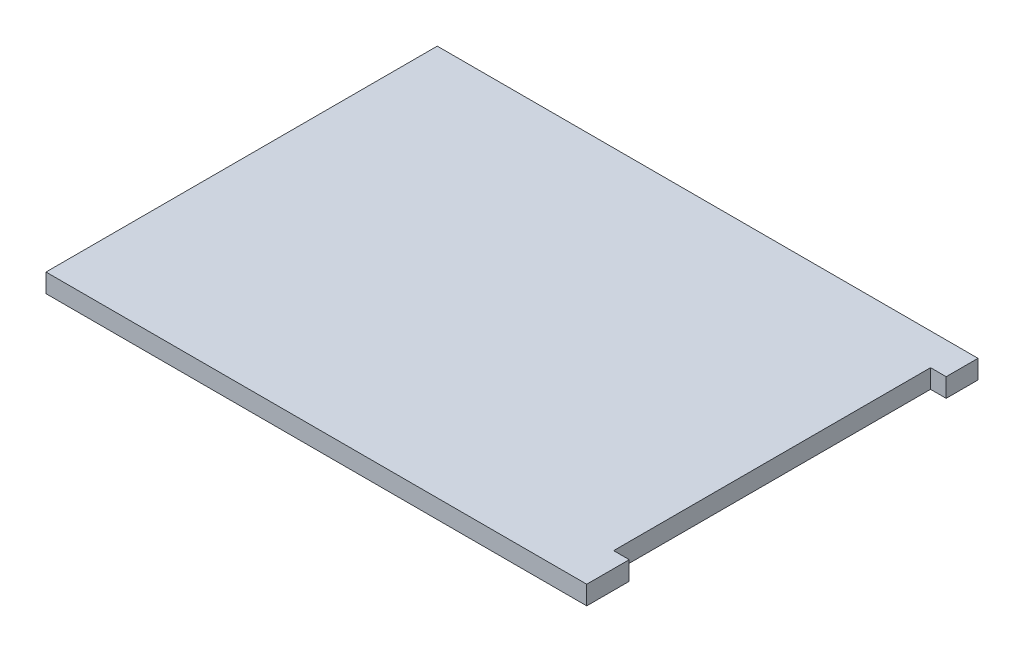
ISO-10303-21;
HEADER;
FILE_DESCRIPTION(('STEP AP214'),'2;1');
FILE_NAME('part.step','',(''),(''),'','','');
FILE_SCHEMA(('AUTOMOTIVE_DESIGN { 1 0 10303 214 1 1 1 1 }'));
ENDSEC;
DATA;
#1=APPLICATION_CONTEXT('core data for automotive mechanical design processes');
#2=APPLICATION_PROTOCOL_DEFINITION('international standard','automotive_design',2000,#1);
#3=PRODUCT_CONTEXT('',#1,'mechanical');
#4=PRODUCT('Part','Part','',(#3));
#5=PRODUCT_RELATED_PRODUCT_CATEGORY('part','',(#4));
#6=PRODUCT_DEFINITION_FORMATION('','',#4);
#7=PRODUCT_DEFINITION_CONTEXT('part definition',#1,'design');
#8=PRODUCT_DEFINITION('design','',#6,#7);
#9=PRODUCT_DEFINITION_SHAPE('','',#8);
#10=(LENGTH_UNIT() NAMED_UNIT(*) SI_UNIT(.MILLI.,.METRE.));
#11=(NAMED_UNIT(*) PLANE_ANGLE_UNIT() SI_UNIT($,.RADIAN.));
#12=(NAMED_UNIT(*) SI_UNIT($,.STERADIAN.) SOLID_ANGLE_UNIT());
#13=UNCERTAINTY_MEASURE_WITH_UNIT(LENGTH_MEASURE(1.E-05),#10,'distance_accuracy_value','');
#14=(GEOMETRIC_REPRESENTATION_CONTEXT(3) GLOBAL_UNCERTAINTY_ASSIGNED_CONTEXT((#13)) GLOBAL_UNIT_ASSIGNED_CONTEXT((#10,
#11,#12)) REPRESENTATION_CONTEXT('',''));
#15=CARTESIAN_POINT('',(0.,0.,0.));
#16=DIRECTION('',(0.,0.,1.));
#17=DIRECTION('',(1.,0.,0.));
#18=AXIS2_PLACEMENT_3D('',#15,#16,#17);
#19=CARTESIAN_POINT('',(37.7,2.4,25.));
#20=DIRECTION('',(-1.,0.,0.));
#21=DIRECTION('',(0.,0.,1.));
#22=AXIS2_PLACEMENT_3D('',#19,#20,#21);
#23=PLANE('',#22);
#24=DIRECTION('',(0.,0.,-1.));
#25=VECTOR('',#24,1.);
#26=CARTESIAN_POINT('',(37.7,2.4,25.));
#27=LINE('',#26,#25);
#28=CARTESIAN_POINT('',(37.7,2.4,-20.932318686014));
#29=VERTEX_POINT('',#28);
#30=CARTESIAN_POINT('',(37.7,2.4,-25.));
#31=VERTEX_POINT('',#30);
#32=EDGE_CURVE('E90',#29,#31,#27,.T.);
#33=ORIENTED_EDGE('',*,*,#32,.F.);
#34=DIRECTION('',(0.,-1.,0.));
#35=VECTOR('',#34,1.);
#36=CARTESIAN_POINT('',(37.7,2.4,-20.932318686014));
#37=LINE('',#36,#35);
#38=CARTESIAN_POINT('',(37.7,0.,-20.932318686014));
#39=VERTEX_POINT('',#38);
#40=EDGE_CURVE('E139',#29,#39,#37,.T.);
#41=ORIENTED_EDGE('',*,*,#40,.T.);
#42=DIRECTION('',(0.,0.,-1.));
#43=VECTOR('',#42,1.);
#44=CARTESIAN_POINT('',(37.7,0.,25.));
#45=LINE('',#44,#43);
#46=CARTESIAN_POINT('',(37.7,0.,-25.));
#47=VERTEX_POINT('',#46);
#48=EDGE_CURVE('E142',#39,#47,#45,.T.);
#49=ORIENTED_EDGE('',*,*,#48,.T.);
#50=DIRECTION('',(0.,-1.,0.));
#51=VECTOR('',#50,1.);
#52=CARTESIAN_POINT('',(37.7,2.4,-25.));
#53=LINE('',#52,#51);
#54=EDGE_CURVE('E47',#31,#47,#53,.T.);
#55=ORIENTED_EDGE('',*,*,#54,.F.);
#56=EDGE_LOOP('',(#33,#41,#49,#55));
#57=FACE_BOUND('',#56,.T.);
#58=ADVANCED_FACE('F39',(#57),#23,.F.);
#59=CARTESIAN_POINT('',(37.7,0.,25.));
#60=VERTEX_POINT('',#59);
#61=CARTESIAN_POINT('',(37.7,0.,19.567681313986));
#62=VERTEX_POINT('',#61);
#63=EDGE_CURVE('E150',#60,#62,#45,.T.);
#64=ORIENTED_EDGE('',*,*,#63,.T.);
#65=DIRECTION('',(0.,1.,0.));
#66=VECTOR('',#65,1.);
#67=CARTESIAN_POINT('',(37.7,2.4,19.567681313986));
#68=LINE('',#67,#66);
#69=CARTESIAN_POINT('',(37.7,2.4,19.567681313986));
#70=VERTEX_POINT('',#69);
#71=EDGE_CURVE('E53',#62,#70,#68,.T.);
#72=ORIENTED_EDGE('',*,*,#71,.T.);
#73=CARTESIAN_POINT('',(37.7,2.4,25.));
#74=VERTEX_POINT('',#73);
#75=EDGE_CURVE('E129',#74,#70,#27,.T.);
#76=ORIENTED_EDGE('',*,*,#75,.F.);
#77=DIRECTION('',(0.,-1.,0.));
#78=VECTOR('',#77,1.);
#79=CARTESIAN_POINT('',(37.7,2.4,25.));
#80=LINE('',#79,#78);
#81=EDGE_CURVE('E149',#74,#60,#80,.T.);
#82=ORIENTED_EDGE('',*,*,#81,.T.);
#83=EDGE_LOOP('',(#64,#72,#76,#82));
#84=FACE_BOUND('',#83,.T.);
#85=ADVANCED_FACE('F41',(#84),#23,.F.);
#86=CARTESIAN_POINT('',(-31.4,2.4,-25.));
#87=DIRECTION('',(0.,0.,1.));
#88=DIRECTION('',(1.,0.,0.));
#89=AXIS2_PLACEMENT_3D('',#86,#87,#88);
#90=PLANE('',#89);
#91=DIRECTION('',(-1.,0.,0.));
#92=VECTOR('',#91,1.);
#93=CARTESIAN_POINT('',(-31.4,0.,-25.));
#94=LINE('',#93,#92);
#95=CARTESIAN_POINT('',(-31.4,0.,-25.));
#96=VERTEX_POINT('',#95);
#97=EDGE_CURVE('E153',#47,#96,#94,.T.);
#98=ORIENTED_EDGE('',*,*,#97,.T.);
#99=DIRECTION('',(0.,-1.,0.));
#100=VECTOR('',#99,1.);
#101=CARTESIAN_POINT('',(-31.4,2.4,-25.));
#102=LINE('',#101,#100);
#103=CARTESIAN_POINT('',(-31.4,2.4,-25.));
#104=VERTEX_POINT('',#103);
#105=EDGE_CURVE('E161',#104,#96,#102,.T.);
#106=ORIENTED_EDGE('',*,*,#105,.F.);
#107=DIRECTION('',(-1.,0.,0.));
#108=VECTOR('',#107,1.);
#109=CARTESIAN_POINT('',(-31.4,2.4,-25.));
#110=LINE('',#109,#108);
#111=EDGE_CURVE('E144',#31,#104,#110,.T.);
#112=ORIENTED_EDGE('',*,*,#111,.F.);
#113=ORIENTED_EDGE('',*,*,#54,.T.);
#114=EDGE_LOOP('',(#98,#106,#112,#113));
#115=FACE_BOUND('',#114,.T.);
#116=ADVANCED_FACE('F166',(#115),#90,.F.);
#117=CARTESIAN_POINT('',(-31.4,2.4,25.));
#118=DIRECTION('',(1.,0.,0.));
#119=DIRECTION('',(0.,0.,-1.));
#120=AXIS2_PLACEMENT_3D('',#117,#118,#119);
#121=PLANE('',#120);
#122=DIRECTION('',(0.,0.,1.));
#123=VECTOR('',#122,1.);
#124=CARTESIAN_POINT('',(-31.4,0.,25.));
#125=LINE('',#124,#123);
#126=CARTESIAN_POINT('',(-31.4,0.,25.));
#127=VERTEX_POINT('',#126);
#128=EDGE_CURVE('E155',#96,#127,#125,.T.);
#129=ORIENTED_EDGE('',*,*,#128,.T.);
#130=DIRECTION('',(0.,-1.,0.));
#131=VECTOR('',#130,1.);
#132=CARTESIAN_POINT('',(-31.4,2.4,25.));
#133=LINE('',#132,#131);
#134=CARTESIAN_POINT('',(-31.4,2.4,25.));
#135=VERTEX_POINT('',#134);
#136=EDGE_CURVE('E159',#135,#127,#133,.T.);
#137=ORIENTED_EDGE('',*,*,#136,.F.);
#138=DIRECTION('',(0.,0.,1.));
#139=VECTOR('',#138,1.);
#140=CARTESIAN_POINT('',(-31.4,2.4,25.));
#141=LINE('',#140,#139);
#142=EDGE_CURVE('E146',#104,#135,#141,.T.);
#143=ORIENTED_EDGE('',*,*,#142,.F.);
#144=ORIENTED_EDGE('',*,*,#105,.T.);
#145=EDGE_LOOP('',(#129,#137,#143,#144));
#146=FACE_BOUND('',#145,.T.);
#147=ADVANCED_FACE('F178',(#146),#121,.F.);
#148=CARTESIAN_POINT('',(-31.4,2.4,25.));
#149=DIRECTION('',(0.,0.,-1.));
#150=DIRECTION('',(-1.,0.,0.));
#151=AXIS2_PLACEMENT_3D('',#148,#149,#150);
#152=PLANE('',#151);
#153=DIRECTION('',(1.,0.,0.));
#154=VECTOR('',#153,1.);
#155=CARTESIAN_POINT('',(-31.4,0.,25.));
#156=LINE('',#155,#154);
#157=EDGE_CURVE('E83',#127,#60,#156,.T.);
#158=ORIENTED_EDGE('',*,*,#157,.T.);
#159=ORIENTED_EDGE('',*,*,#81,.F.);
#160=DIRECTION('',(1.,0.,0.));
#161=VECTOR('',#160,1.);
#162=CARTESIAN_POINT('',(-31.4,2.4,25.));
#163=LINE('',#162,#161);
#164=EDGE_CURVE('E62',#135,#74,#163,.T.);
#165=ORIENTED_EDGE('',*,*,#164,.F.);
#166=ORIENTED_EDGE('',*,*,#136,.T.);
#167=EDGE_LOOP('',(#158,#159,#165,#166));
#168=FACE_BOUND('',#167,.T.);
#169=ADVANCED_FACE('F180',(#168),#152,.F.);
#170=CARTESIAN_POINT('',(0.,2.4,0.));
#171=DIRECTION('',(0.,-1.,0.));
#172=DIRECTION('',(0.,0.,-1.));
#173=AXIS2_PLACEMENT_3D('',#170,#171,#172);
#174=PLANE('',#173);
#175=DIRECTION('',(0.,0.,-1.));
#176=VECTOR('',#175,1.);
#177=CARTESIAN_POINT('',(35.7033053803765,2.4,-20.932318686014));
#178=LINE('',#177,#176);
#179=CARTESIAN_POINT('',(35.7033053803765,2.4,19.567681313986));
#180=VERTEX_POINT('',#179);
#181=CARTESIAN_POINT('',(35.7033053803765,2.4,-20.932318686014));
#182=VERTEX_POINT('',#181);
#183=EDGE_CURVE('E123',#180,#182,#178,.T.);
#184=ORIENTED_EDGE('',*,*,#183,.T.);
#185=DIRECTION('',(1.,0.,0.));
#186=VECTOR('',#185,1.);
#187=CARTESIAN_POINT('',(35.7033053803765,2.4,-20.932318686014));
#188=LINE('',#187,#186);
#189=EDGE_CURVE('E120',#182,#29,#188,.T.);
#190=ORIENTED_EDGE('',*,*,#189,.T.);
#191=ORIENTED_EDGE('',*,*,#32,.T.);
#192=ORIENTED_EDGE('',*,*,#111,.T.);
#193=ORIENTED_EDGE('',*,*,#142,.T.);
#194=ORIENTED_EDGE('',*,*,#164,.T.);
#195=ORIENTED_EDGE('',*,*,#75,.T.);
#196=DIRECTION('',(-1.,0.,0.));
#197=VECTOR('',#196,1.);
#198=CARTESIAN_POINT('',(35.7033053803765,2.4,19.567681313986));
#199=LINE('',#198,#197);
#200=EDGE_CURVE('E115',#70,#180,#199,.T.);
#201=ORIENTED_EDGE('',*,*,#200,.T.);
#202=EDGE_LOOP('',(#184,#190,#191,#192,#193,#194,#195,#201));
#203=FACE_BOUND('',#202,.T.);
#204=ADVANCED_FACE('F127',(#203),#174,.F.);
#205=CARTESIAN_POINT('',(0.,0.,0.));
#206=DIRECTION('',(0.,-1.,0.));
#207=DIRECTION('',(0.,0.,-1.));
#208=AXIS2_PLACEMENT_3D('',#205,#206,#207);
#209=PLANE('',#208);
#210=DIRECTION('',(1.,0.,0.));
#211=VECTOR('',#210,1.);
#212=CARTESIAN_POINT('',(35.7033053803765,0.,-20.932318686014));
#213=LINE('',#212,#211);
#214=CARTESIAN_POINT('',(35.7033053803765,0.,-20.932318686014));
#215=VERTEX_POINT('',#214);
#216=EDGE_CURVE('E130',#215,#39,#213,.T.);
#217=ORIENTED_EDGE('',*,*,#216,.F.);
#218=DIRECTION('',(0.,0.,-1.));
#219=VECTOR('',#218,1.);
#220=CARTESIAN_POINT('',(35.7033053803765,0.,-20.932318686014));
#221=LINE('',#220,#219);
#222=CARTESIAN_POINT('',(35.7033053803765,0.,19.567681313986));
#223=VERTEX_POINT('',#222);
#224=EDGE_CURVE('E132',#223,#215,#221,.T.);
#225=ORIENTED_EDGE('',*,*,#224,.F.);
#226=DIRECTION('',(-1.,0.,0.));
#227=VECTOR('',#226,1.);
#228=CARTESIAN_POINT('',(0.,0.,19.5676813139861));
#229=LINE('',#228,#227);
#230=EDGE_CURVE('E11',#62,#223,#229,.T.);
#231=ORIENTED_EDGE('',*,*,#230,.F.);
#232=ORIENTED_EDGE('',*,*,#63,.F.);
#233=ORIENTED_EDGE('',*,*,#157,.F.);
#234=ORIENTED_EDGE('',*,*,#128,.F.);
#235=ORIENTED_EDGE('',*,*,#97,.F.);
#236=ORIENTED_EDGE('',*,*,#48,.F.);
#237=EDGE_LOOP('',(#217,#225,#231,#232,#233,#234,#235,#236));
#238=FACE_BOUND('',#237,.T.);
#239=ADVANCED_FACE('F174',(#238),#209,.T.);
#240=CARTESIAN_POINT('',(35.7033053803765,2.4,-20.932318686014));
#241=DIRECTION('',(0.,0.,-1.));
#242=DIRECTION('',(-1.,0.,0.));
#243=AXIS2_PLACEMENT_3D('',#240,#241,#242);
#244=PLANE('',#243);
#245=ORIENTED_EDGE('',*,*,#189,.F.);
#246=DIRECTION('',(0.,-1.,0.));
#247=VECTOR('',#246,1.);
#248=CARTESIAN_POINT('',(35.7033053803765,2.4,-20.932318686014));
#249=LINE('',#248,#247);
#250=EDGE_CURVE('E119',#182,#215,#249,.T.);
#251=ORIENTED_EDGE('',*,*,#250,.T.);
#252=ORIENTED_EDGE('',*,*,#216,.T.);
#253=ORIENTED_EDGE('',*,*,#40,.F.);
#254=EDGE_LOOP('',(#245,#251,#252,#253));
#255=FACE_BOUND('',#254,.T.);
#256=ADVANCED_FACE('F183',(#255),#244,.F.);
#257=CARTESIAN_POINT('',(35.7033053803765,2.4,19.567681313986));
#258=DIRECTION('',(0.,0.,1.));
#259=DIRECTION('',(1.,0.,0.));
#260=AXIS2_PLACEMENT_3D('',#257,#258,#259);
#261=PLANE('',#260);
#262=ORIENTED_EDGE('',*,*,#230,.T.);
#263=DIRECTION('',(0.,-1.,0.));
#264=VECTOR('',#263,1.);
#265=CARTESIAN_POINT('',(35.7033053803765,2.4,19.567681313986));
#266=LINE('',#265,#264);
#267=EDGE_CURVE('E111',#180,#223,#266,.T.);
#268=ORIENTED_EDGE('',*,*,#267,.F.);
#269=ORIENTED_EDGE('',*,*,#200,.F.);
#270=ORIENTED_EDGE('',*,*,#71,.F.);
#271=EDGE_LOOP('',(#262,#268,#269,#270));
#272=FACE_BOUND('',#271,.T.);
#273=ADVANCED_FACE('F113',(#272),#261,.F.);
#274=CARTESIAN_POINT('',(35.7033053803765,2.4,-20.932318686014));
#275=DIRECTION('',(-1.,0.,0.));
#276=DIRECTION('',(0.,0.,1.));
#277=AXIS2_PLACEMENT_3D('',#274,#275,#276);
#278=PLANE('',#277);
#279=ORIENTED_EDGE('',*,*,#224,.T.);
#280=ORIENTED_EDGE('',*,*,#250,.F.);
#281=ORIENTED_EDGE('',*,*,#183,.F.);
#282=ORIENTED_EDGE('',*,*,#267,.T.);
#283=EDGE_LOOP('',(#279,#280,#281,#282));
#284=FACE_BOUND('',#283,.T.);
#285=ADVANCED_FACE('F124',(#284),#278,.F.);
#286=CLOSED_SHELL('',(#58,#85,#116,#147,#169,#204,#239,#256,#273,#285));
#287=MANIFOLD_SOLID_BREP('B2',#286);
#288=ADVANCED_BREP_SHAPE_REPRESENTATION('',(#18,#287),#14);
#289=SHAPE_DEFINITION_REPRESENTATION(#9,#288);
ENDSEC;
END-ISO-10303-21;
